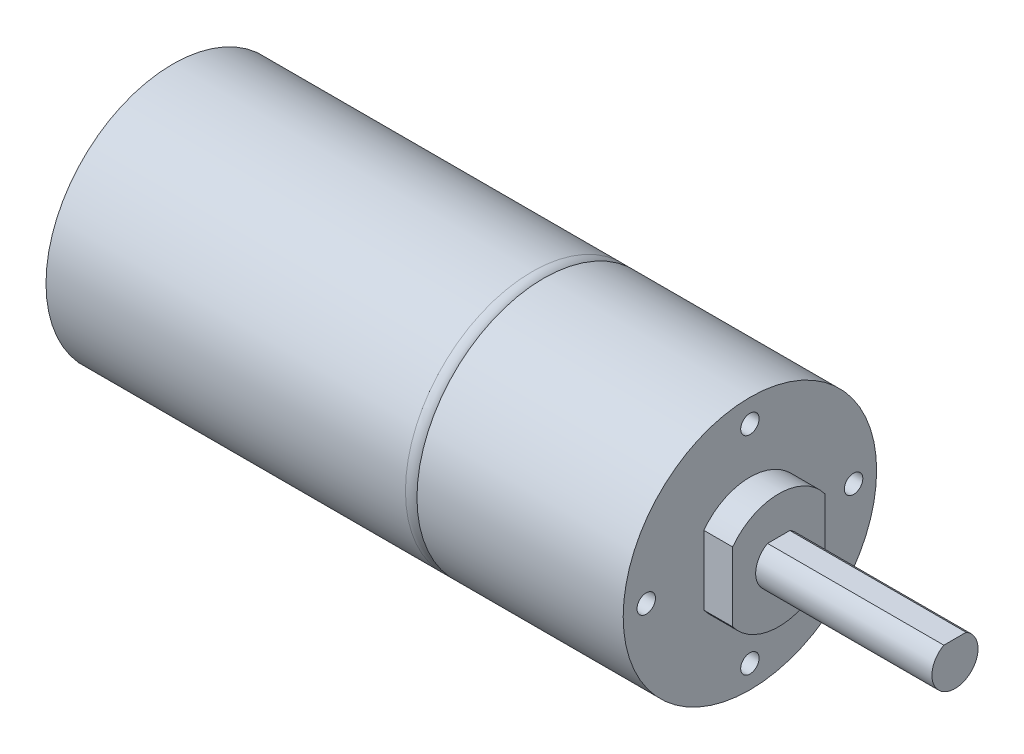
ISO-10303-21;
HEADER;
FILE_DESCRIPTION(('STEP AP214'),'2;1');
FILE_NAME('part.step','',(''),(''),'','','');
FILE_SCHEMA(('AUTOMOTIVE_DESIGN { 1 0 10303 214 1 1 1 1 }'));
ENDSEC;
DATA;
#1=APPLICATION_CONTEXT('core data for automotive mechanical design processes');
#2=APPLICATION_PROTOCOL_DEFINITION('international standard','automotive_design',2000,#1);
#3=PRODUCT_CONTEXT('',#1,'mechanical');
#4=PRODUCT('Part','Part','',(#3));
#5=PRODUCT_RELATED_PRODUCT_CATEGORY('part','',(#4));
#6=PRODUCT_DEFINITION_FORMATION('','',#4);
#7=PRODUCT_DEFINITION_CONTEXT('part definition',#1,'design');
#8=PRODUCT_DEFINITION('design','',#6,#7);
#9=PRODUCT_DEFINITION_SHAPE('','',#8);
#10=(LENGTH_UNIT() NAMED_UNIT(*) SI_UNIT(.MILLI.,.METRE.));
#11=(NAMED_UNIT(*) PLANE_ANGLE_UNIT() SI_UNIT($,.RADIAN.));
#12=(NAMED_UNIT(*) SI_UNIT($,.STERADIAN.) SOLID_ANGLE_UNIT());
#13=UNCERTAINTY_MEASURE_WITH_UNIT(LENGTH_MEASURE(1.E-05),#10,'distance_accuracy_value','');
#14=(GEOMETRIC_REPRESENTATION_CONTEXT(3) GLOBAL_UNCERTAINTY_ASSIGNED_CONTEXT((#13)) GLOBAL_UNIT_ASSIGNED_CONTEXT((#10,
#11,#12)) REPRESENTATION_CONTEXT('',''));
#15=CARTESIAN_POINT('',(0.,0.,0.));
#16=DIRECTION('',(0.,0.,1.));
#17=DIRECTION('',(1.,0.,0.));
#18=AXIS2_PLACEMENT_3D('',#15,#16,#17);
#19=CARTESIAN_POINT('',(20.4,0.,0.));
#20=DIRECTION('',(1.,0.,0.));
#21=DIRECTION('',(0.,0.,-1.));
#22=AXIS2_PLACEMENT_3D('',#19,#20,#21);
#23=PLANE('',#22);
#24=CARTESIAN_POINT('',(20.4,0.,0.));
#25=DIRECTION('',(1.,0.,0.));
#26=DIRECTION('',(0.,0.,-1.));
#27=AXIS2_PLACEMENT_3D('',#24,#25,#26);
#28=CIRCLE('',#27,5.);
#29=CARTESIAN_POINT('',(20.4,3.,-4.));
#30=VERTEX_POINT('',#29);
#31=CARTESIAN_POINT('',(20.4,3.,4.));
#32=VERTEX_POINT('',#31);
#33=EDGE_CURVE('E147',#30,#32,#28,.T.);
#34=ORIENTED_EDGE('',*,*,#33,.T.);
#35=DIRECTION('',(0.,-1.,0.));
#36=VECTOR('',#35,1.);
#37=CARTESIAN_POINT('',(20.4,0.,4.));
#38=LINE('',#37,#36);
#39=CARTESIAN_POINT('',(20.4,-3.,4.));
#40=VERTEX_POINT('',#39);
#41=EDGE_CURVE('E150',#32,#40,#38,.T.);
#42=ORIENTED_EDGE('',*,*,#41,.T.);
#43=CARTESIAN_POINT('',(20.4,-3.,-4.));
#44=VERTEX_POINT('',#43);
#45=EDGE_CURVE('E152',#40,#44,#28,.T.);
#46=ORIENTED_EDGE('',*,*,#45,.T.);
#47=DIRECTION('',(0.,-1.,0.));
#48=VECTOR('',#47,1.);
#49=CARTESIAN_POINT('',(20.4,0.,-4.));
#50=LINE('',#49,#48);
#51=EDGE_CURVE('E154',#30,#44,#50,.T.);
#52=ORIENTED_EDGE('',*,*,#51,.F.);
#53=EDGE_LOOP('',(#34,#42,#46,#52));
#54=FACE_BOUND('',#53,.T.);
#55=CARTESIAN_POINT('',(20.4,0.,0.));
#56=DIRECTION('',(1.,0.,0.));
#57=DIRECTION('',(0.,0.,-1.));
#58=AXIS2_PLACEMENT_3D('',#55,#56,#57);
#59=CIRCLE('',#58,2.);
#60=CARTESIAN_POINT('',(20.4,1.75,0.968245836551854));
#61=VERTEX_POINT('',#60);
#62=CARTESIAN_POINT('',(20.4,1.75,-0.968245836551854));
#63=VERTEX_POINT('',#62);
#64=EDGE_CURVE('E53',#61,#63,#59,.T.);
#65=ORIENTED_EDGE('',*,*,#64,.F.);
#66=DIRECTION('',(0.,0.,-1.));
#67=VECTOR('',#66,1.);
#68=CARTESIAN_POINT('',(20.4,1.75,0.));
#69=LINE('',#68,#67);
#70=EDGE_CURVE('E134',#61,#63,#69,.T.);
#71=ORIENTED_EDGE('',*,*,#70,.T.);
#72=EDGE_LOOP('',(#65,#71));
#73=FACE_BOUND('',#72,.T.);
#74=ADVANCED_FACE('F39',(#54,#73),#23,.T.);
#75=CARTESIAN_POINT('',(17.9,0.,0.));
#76=DIRECTION('',(-1.,0.,0.));
#77=DIRECTION('',(0.,0.,1.));
#78=AXIS2_PLACEMENT_3D('',#75,#76,#77);
#79=CYLINDRICAL_SURFACE('',#78,11.);
#80=CARTESIAN_POINT('',(-1.,0.,0.));
#81=DIRECTION('',(1.,0.,0.));
#82=DIRECTION('',(0.,0.,-1.));
#83=AXIS2_PLACEMENT_3D('',#80,#81,#82);
#84=CIRCLE('',#83,11.);
#85=CARTESIAN_POINT('',(-1.,0.,11.));
#86=VERTEX_POINT('',#85);
#87=EDGE_CURVE('E180',#86,#86,#84,.T.);
#88=CARTESIAN_POINT('',(-32.2,0.,0.));
#89=DIRECTION('',(-1.,0.,0.));
#90=DIRECTION('',(0.,0.,1.));
#91=AXIS2_PLACEMENT_3D('',#88,#89,#90);
#92=CIRCLE('',#91,11.);
#93=CARTESIAN_POINT('',(-32.2,0.,11.));
#94=VERTEX_POINT('',#93);
#95=EDGE_CURVE('E47',#94,#94,#92,.T.);
#96=CARTESIAN_POINT('',(-1.,0.,11.));
#97=CARTESIAN_POINT('',(-1.325,0.,11.));
#98=CARTESIAN_POINT('',(-1.65,0.,11.));
#99=CARTESIAN_POINT('',(-2.3,0.,11.));
#100=CARTESIAN_POINT('',(-2.625,0.,11.));
#101=CARTESIAN_POINT('',(-3.275,0.,11.));
#102=CARTESIAN_POINT('',(-3.6,0.,11.));
#103=CARTESIAN_POINT('',(-4.25,0.,11.));
#104=CARTESIAN_POINT('',(-4.57500000000001,0.,11.));
#105=CARTESIAN_POINT('',(-5.225,0.,11.));
#106=CARTESIAN_POINT('',(-5.55000000000001,0.,11.));
#107=CARTESIAN_POINT('',(-6.2,0.,11.));
#108=CARTESIAN_POINT('',(-6.52500000000001,0.,11.));
#109=CARTESIAN_POINT('',(-7.175,0.,11.));
#110=CARTESIAN_POINT('',(-7.5,0.,11.));
#111=CARTESIAN_POINT('',(-8.15,0.,11.));
#112=CARTESIAN_POINT('',(-8.475,0.,11.));
#113=CARTESIAN_POINT('',(-9.12500000000001,0.,11.));
#114=CARTESIAN_POINT('',(-9.45,0.,11.));
#115=CARTESIAN_POINT('',(-10.1,0.,11.));
#116=CARTESIAN_POINT('',(-10.425,0.,11.));
#117=CARTESIAN_POINT('',(-11.075,0.,11.));
#118=CARTESIAN_POINT('',(-11.4,0.,11.));
#119=CARTESIAN_POINT('',(-12.05,0.,11.));
#120=CARTESIAN_POINT('',(-12.375,0.,11.));
#121=CARTESIAN_POINT('',(-13.025,0.,11.));
#122=CARTESIAN_POINT('',(-13.35,0.,11.));
#123=CARTESIAN_POINT('',(-14.,0.,11.));
#124=CARTESIAN_POINT('',(-14.325,0.,11.));
#125=CARTESIAN_POINT('',(-14.975,0.,11.));
#126=CARTESIAN_POINT('',(-15.3,0.,11.));
#127=CARTESIAN_POINT('',(-15.95,0.,11.));
#128=CARTESIAN_POINT('',(-16.275,0.,11.));
#129=CARTESIAN_POINT('',(-16.925,0.,11.));
#130=CARTESIAN_POINT('',(-17.25,0.,11.));
#131=CARTESIAN_POINT('',(-17.9,0.,11.));
#132=CARTESIAN_POINT('',(-18.225,0.,11.));
#133=CARTESIAN_POINT('',(-18.875,0.,11.));
#134=CARTESIAN_POINT('',(-19.2,0.,11.));
#135=CARTESIAN_POINT('',(-19.85,0.,11.));
#136=CARTESIAN_POINT('',(-20.175,0.,11.));
#137=CARTESIAN_POINT('',(-20.825,0.,11.));
#138=CARTESIAN_POINT('',(-21.15,0.,11.));
#139=CARTESIAN_POINT('',(-21.8,0.,11.));
#140=CARTESIAN_POINT('',(-22.125,0.,11.));
#141=CARTESIAN_POINT('',(-22.775,0.,11.));
#142=CARTESIAN_POINT('',(-23.1,0.,11.));
#143=CARTESIAN_POINT('',(-23.75,0.,11.));
#144=CARTESIAN_POINT('',(-24.075,0.,11.));
#145=CARTESIAN_POINT('',(-24.725,0.,11.));
#146=CARTESIAN_POINT('',(-25.05,0.,11.));
#147=CARTESIAN_POINT('',(-25.7,0.,11.));
#148=CARTESIAN_POINT('',(-26.025,0.,11.));
#149=CARTESIAN_POINT('',(-26.675,0.,11.));
#150=CARTESIAN_POINT('',(-27.,0.,11.));
#151=CARTESIAN_POINT('',(-27.65,0.,11.));
#152=CARTESIAN_POINT('',(-27.975,0.,11.));
#153=CARTESIAN_POINT('',(-28.625,0.,11.));
#154=CARTESIAN_POINT('',(-28.95,0.,11.));
#155=CARTESIAN_POINT('',(-29.6,0.,11.));
#156=CARTESIAN_POINT('',(-29.925,0.,11.));
#157=CARTESIAN_POINT('',(-30.575,0.,11.));
#158=CARTESIAN_POINT('',(-30.9,0.,11.));
#159=CARTESIAN_POINT('',(-31.55,0.,11.));
#160=CARTESIAN_POINT('',(-31.875,0.,11.));
#161=CARTESIAN_POINT('',(-32.2,0.,11.));
#162=B_SPLINE_CURVE_WITH_KNOTS('',3,(#96,#97,#98,#99,#100,#101,#102,#103,#104,#105,#106,#107,
#108,#109,#110,#111,#112,#113,#114,#115,#116,#117,#118,#119,#120,#121,#122,#123,#124,#125,#126,
#127,#128,#129,#130,#131,#132,#133,#134,#135,#136,#137,#138,#139,#140,#141,#142,#143,#144,#145,
#146,#147,#148,#149,#150,#151,#152,#153,#154,#155,#156,#157,#158,#159,#160,#161),.UNSPECIFIED.,
.F.,.F.,(4,2,2,2,2,2,2,2,2,2,2,2,2,2,2,2,2,2,2,2,2,2,2,2,2,2,2,2,2,2,2,2,4),(0.,0.975,1.95,
2.925,3.9,4.875,5.85,6.825,7.8,8.775,9.75,10.725,11.7,12.675,13.65,14.625,15.6,16.575,17.55,
18.525,19.5,20.475,21.45,22.425,23.4,24.375,25.35,26.325,27.3,28.275,29.25,30.225,31.2),.UNSPECIFIED.);
#163=EDGE_CURVE('BSEAM187',#86,#94,#162,.T.);
#164=ORIENTED_EDGE('',*,*,#87,.F.);
#165=ORIENTED_EDGE('',*,*,#95,.F.);
#166=ORIENTED_EDGE('',*,*,#163,.T.);
#167=ORIENTED_EDGE('',*,*,#163,.F.);
#168=EDGE_LOOP('',(#164,#166,#165,#167));
#169=FACE_BOUND('',#168,.T.);
#170=ADVANCED_FACE('F187',(#169),#79,.T.);
#171=CARTESIAN_POINT('',(-32.2,0.,0.));
#172=DIRECTION('',(-1.,0.,0.));
#173=DIRECTION('',(0.,0.,1.));
#174=AXIS2_PLACEMENT_3D('',#171,#172,#173);
#175=PLANE('',#174);
#176=ORIENTED_EDGE('',*,*,#95,.T.);
#177=EDGE_LOOP('',(#176));
#178=FACE_BOUND('',#177,.T.);
#179=ADVANCED_FACE('F185',(#178),#175,.T.);
#180=CARTESIAN_POINT('',(-1.,0.,0.));
#181=DIRECTION('',(1.,0.,0.));
#182=DIRECTION('',(0.,0.,-1.));
#183=AXIS2_PLACEMENT_3D('',#180,#181,#182);
#184=TOROIDAL_SURFACE('',#183,10.,1.);
#185=CARTESIAN_POINT('',(0.,0.,0.));
#186=DIRECTION('',(1.,0.,0.));
#187=DIRECTION('',(0.,0.,-1.));
#188=AXIS2_PLACEMENT_3D('',#185,#186,#187);
#189=CIRCLE('',#188,10.);
#190=CARTESIAN_POINT('',(0.,0.,-10.));
#191=VERTEX_POINT('',#190);
#192=EDGE_CURVE('E177',#191,#191,#189,.T.);
#193=ORIENTED_EDGE('',*,*,#192,.F.);
#194=EDGE_LOOP('',(#193));
#195=FACE_BOUND('',#194,.T.);
#196=ORIENTED_EDGE('',*,*,#87,.T.);
#197=EDGE_LOOP('',(#196));
#198=FACE_BOUND('',#197,.T.);
#199=ADVANCED_FACE('F194',(#195,#198),#184,.T.);
#200=CARTESIAN_POINT('',(0.,11.,0.));
#201=DIRECTION('',(1.,0.,0.));
#202=DIRECTION('',(0.,0.,-1.));
#203=AXIS2_PLACEMENT_3D('',#200,#201,#202);
#204=PLANE('',#203);
#205=CARTESIAN_POINT('',(0.,0.,0.));
#206=DIRECTION('',(1.,0.,0.));
#207=DIRECTION('',(0.,0.,-1.));
#208=AXIS2_PLACEMENT_3D('',#205,#206,#207);
#209=CIRCLE('',#208,11.);
#210=CARTESIAN_POINT('',(0.,0.,11.));
#211=VERTEX_POINT('',#210);
#212=EDGE_CURVE('E174',#211,#211,#209,.T.);
#213=ORIENTED_EDGE('',*,*,#212,.F.);
#214=EDGE_LOOP('',(#213));
#215=FACE_BOUND('',#214,.T.);
#216=ORIENTED_EDGE('',*,*,#192,.T.);
#217=EDGE_LOOP('',(#216));
#218=FACE_BOUND('',#217,.T.);
#219=ADVANCED_FACE('F211',(#215,#218),#204,.F.);
#220=CARTESIAN_POINT('',(17.9,0.,0.));
#221=DIRECTION('',(1.,0.,0.));
#222=DIRECTION('',(0.,0.,-1.));
#223=AXIS2_PLACEMENT_3D('',#220,#221,#222);
#224=PLANE('',#223);
#225=CARTESIAN_POINT('',(17.9,9.,0.));
#226=DIRECTION('',(1.,0.,0.));
#227=DIRECTION('',(0.,0.,-1.));
#228=AXIS2_PLACEMENT_3D('',#225,#226,#227);
#229=CIRCLE('',#228,0.8);
#230=CARTESIAN_POINT('',(17.9,9.,-0.8));
#231=VERTEX_POINT('',#230);
#232=EDGE_CURVE('E111',#231,#231,#229,.T.);
#233=ORIENTED_EDGE('',*,*,#232,.F.);
#234=EDGE_LOOP('',(#233));
#235=FACE_BOUND('',#234,.T.);
#236=CARTESIAN_POINT('',(17.9,0.,9.));
#237=DIRECTION('',(1.,0.,0.));
#238=DIRECTION('',(0.,0.,-1.));
#239=AXIS2_PLACEMENT_3D('',#236,#237,#238);
#240=CIRCLE('',#239,0.8);
#241=CARTESIAN_POINT('',(17.9,0.,8.2));
#242=VERTEX_POINT('',#241);
#243=EDGE_CURVE('E119',#242,#242,#240,.T.);
#244=ORIENTED_EDGE('',*,*,#243,.F.);
#245=EDGE_LOOP('',(#244));
#246=FACE_BOUND('',#245,.T.);
#247=CARTESIAN_POINT('',(17.9,0.,-9.));
#248=DIRECTION('',(1.,0.,0.));
#249=DIRECTION('',(0.,0.,-1.));
#250=AXIS2_PLACEMENT_3D('',#247,#248,#249);
#251=CIRCLE('',#250,0.8);
#252=CARTESIAN_POINT('',(17.9,0.,-9.8));
#253=VERTEX_POINT('',#252);
#254=EDGE_CURVE('E125',#253,#253,#251,.T.);
#255=ORIENTED_EDGE('',*,*,#254,.F.);
#256=EDGE_LOOP('',(#255));
#257=FACE_BOUND('',#256,.T.);
#258=CARTESIAN_POINT('',(17.9,-9.,0.));
#259=DIRECTION('',(1.,0.,0.));
#260=DIRECTION('',(0.,0.,-1.));
#261=AXIS2_PLACEMENT_3D('',#258,#259,#260);
#262=CIRCLE('',#261,0.8);
#263=CARTESIAN_POINT('',(17.9,-9.,-0.800000000000001));
#264=VERTEX_POINT('',#263);
#265=EDGE_CURVE('E131',#264,#264,#262,.T.);
#266=ORIENTED_EDGE('',*,*,#265,.F.);
#267=EDGE_LOOP('',(#266));
#268=FACE_BOUND('',#267,.T.);
#269=CARTESIAN_POINT('',(17.9,0.,0.));
#270=DIRECTION('',(1.,0.,0.));
#271=DIRECTION('',(0.,0.,-1.));
#272=AXIS2_PLACEMENT_3D('',#269,#270,#271);
#273=CIRCLE('',#272,5.);
#274=CARTESIAN_POINT('',(17.9,3.,-4.));
#275=VERTEX_POINT('',#274);
#276=CARTESIAN_POINT('',(17.9,3.,4.));
#277=VERTEX_POINT('',#276);
#278=EDGE_CURVE('E61',#275,#277,#273,.T.);
#279=ORIENTED_EDGE('',*,*,#278,.F.);
#280=DIRECTION('',(0.,-1.,0.));
#281=VECTOR('',#280,1.);
#282=CARTESIAN_POINT('',(17.9,0.,-4.));
#283=LINE('',#282,#281);
#284=CARTESIAN_POINT('',(17.9,-3.,-4.));
#285=VERTEX_POINT('',#284);
#286=EDGE_CURVE('E151',#275,#285,#283,.T.);
#287=ORIENTED_EDGE('',*,*,#286,.T.);
#288=CARTESIAN_POINT('',(17.9,-3.,4.));
#289=VERTEX_POINT('',#288);
#290=EDGE_CURVE('E160',#289,#285,#273,.T.);
#291=ORIENTED_EDGE('',*,*,#290,.F.);
#292=DIRECTION('',(0.,-1.,0.));
#293=VECTOR('',#292,1.);
#294=CARTESIAN_POINT('',(17.9,0.,4.));
#295=LINE('',#294,#293);
#296=EDGE_CURVE('E159',#277,#289,#295,.T.);
#297=ORIENTED_EDGE('',*,*,#296,.F.);
#298=EDGE_LOOP('',(#279,#287,#291,#297));
#299=FACE_BOUND('',#298,.T.);
#300=CARTESIAN_POINT('',(17.9,0.,0.));
#301=DIRECTION('',(1.,0.,0.));
#302=DIRECTION('',(0.,0.,-1.));
#303=AXIS2_PLACEMENT_3D('',#300,#301,#302);
#304=CIRCLE('',#303,11.);
#305=CARTESIAN_POINT('',(17.9,0.,11.));
#306=VERTEX_POINT('',#305);
#307=EDGE_CURVE('E11',#306,#306,#304,.T.);
#308=ORIENTED_EDGE('',*,*,#307,.T.);
#309=EDGE_LOOP('',(#308));
#310=FACE_BOUND('',#309,.T.);
#311=ADVANCED_FACE('F201',(#235,#246,#257,#268,#299,#310),#224,.T.);
#312=CARTESIAN_POINT('',(0.,0.,11.));
#313=CARTESIAN_POINT('',(0.18645833333333,0.,11.));
#314=CARTESIAN_POINT('',(0.372916666666664,0.,11.));
#315=CARTESIAN_POINT('',(0.745833333333331,0.,11.));
#316=CARTESIAN_POINT('',(0.932291666666665,0.,11.));
#317=CARTESIAN_POINT('',(1.30520833333333,0.,11.));
#318=CARTESIAN_POINT('',(1.49166666666666,0.,11.));
#319=CARTESIAN_POINT('',(1.86458333333333,0.,11.));
#320=CARTESIAN_POINT('',(2.05104166666666,0.,11.));
#321=CARTESIAN_POINT('',(2.42395833333333,0.,11.));
#322=CARTESIAN_POINT('',(2.61041666666666,0.,11.));
#323=CARTESIAN_POINT('',(2.98333333333333,0.,11.));
#324=CARTESIAN_POINT('',(3.16979166666666,0.,11.));
#325=CARTESIAN_POINT('',(3.54270833333333,0.,11.));
#326=CARTESIAN_POINT('',(3.72916666666666,0.,11.));
#327=CARTESIAN_POINT('',(4.10208333333333,0.,11.));
#328=CARTESIAN_POINT('',(4.28854166666666,0.,11.));
#329=CARTESIAN_POINT('',(4.66145833333333,0.,11.));
#330=CARTESIAN_POINT('',(4.84791666666666,0.,11.));
#331=CARTESIAN_POINT('',(5.22083333333333,0.,11.));
#332=CARTESIAN_POINT('',(5.40729166666666,0.,11.));
#333=CARTESIAN_POINT('',(5.78020833333333,0.,11.));
#334=CARTESIAN_POINT('',(5.96666666666666,0.,11.));
#335=CARTESIAN_POINT('',(6.33958333333333,0.,11.));
#336=CARTESIAN_POINT('',(6.52604166666666,0.,11.));
#337=CARTESIAN_POINT('',(6.89895833333333,0.,11.));
#338=CARTESIAN_POINT('',(7.08541666666666,0.,11.));
#339=CARTESIAN_POINT('',(7.45833333333333,0.,11.));
#340=CARTESIAN_POINT('',(7.64479166666666,0.,11.));
#341=CARTESIAN_POINT('',(8.01770833333333,0.,11.));
#342=CARTESIAN_POINT('',(8.20416666666666,0.,11.));
#343=CARTESIAN_POINT('',(8.57708333333333,0.,11.));
#344=CARTESIAN_POINT('',(8.76354166666667,0.,11.));
#345=CARTESIAN_POINT('',(9.13645833333333,0.,11.));
#346=CARTESIAN_POINT('',(9.32291666666666,0.,11.));
#347=CARTESIAN_POINT('',(9.69583333333333,0.,11.));
#348=CARTESIAN_POINT('',(9.88229166666666,0.,11.));
#349=CARTESIAN_POINT('',(10.2552083333333,0.,11.));
#350=CARTESIAN_POINT('',(10.4416666666667,0.,11.));
#351=CARTESIAN_POINT('',(10.8145833333333,0.,11.));
#352=CARTESIAN_POINT('',(11.0010416666667,0.,11.));
#353=CARTESIAN_POINT('',(11.3739583333333,0.,11.));
#354=CARTESIAN_POINT('',(11.5604166666667,0.,11.));
#355=CARTESIAN_POINT('',(11.9333333333333,0.,11.));
#356=CARTESIAN_POINT('',(12.1197916666667,0.,11.));
#357=CARTESIAN_POINT('',(12.4927083333333,0.,11.));
#358=CARTESIAN_POINT('',(12.6791666666667,0.,11.));
#359=CARTESIAN_POINT('',(13.0520833333333,0.,11.));
#360=CARTESIAN_POINT('',(13.2385416666667,0.,11.));
#361=CARTESIAN_POINT('',(13.6114583333333,0.,11.));
#362=CARTESIAN_POINT('',(13.7979166666667,0.,11.));
#363=CARTESIAN_POINT('',(14.1708333333333,0.,11.));
#364=CARTESIAN_POINT('',(14.3572916666667,0.,11.));
#365=CARTESIAN_POINT('',(14.7302083333333,0.,11.));
#366=CARTESIAN_POINT('',(14.9166666666667,0.,11.));
#367=CARTESIAN_POINT('',(15.2895833333333,0.,11.));
#368=CARTESIAN_POINT('',(15.4760416666667,0.,11.));
#369=CARTESIAN_POINT('',(15.8489583333333,0.,11.));
#370=CARTESIAN_POINT('',(16.0354166666667,0.,11.));
#371=CARTESIAN_POINT('',(16.4083333333333,0.,11.));
#372=CARTESIAN_POINT('',(16.5947916666667,0.,11.));
#373=CARTESIAN_POINT('',(16.9677083333333,0.,11.));
#374=CARTESIAN_POINT('',(17.1541666666667,0.,11.));
#375=CARTESIAN_POINT('',(17.5270833333333,0.,11.));
#376=CARTESIAN_POINT('',(17.7135416666667,0.,11.));
#377=CARTESIAN_POINT('',(17.9,0.,11.));
#378=B_SPLINE_CURVE_WITH_KNOTS('',3,(#312,#313,#314,#315,#316,#317,#318,#319,#320,#321,#322,
#323,#324,#325,#326,#327,#328,#329,#330,#331,#332,#333,#334,#335,#336,#337,#338,#339,#340,#341,
#342,#343,#344,#345,#346,#347,#348,#349,#350,#351,#352,#353,#354,#355,#356,#357,#358,#359,#360,
#361,#362,#363,#364,#365,#366,#367,#368,#369,#370,#371,#372,#373,#374,#375,#376,#377),
.UNSPECIFIED.,.F.,.F.,(4,2,2,2,2,2,2,2,2,2,2,2,2,2,2,2,2,2,2,2,2,2,2,2,2,2,2,2,2,2,2,2,4),(0.,
0.559375000000001,1.11875,1.678125,2.2375,2.796875,3.35625,3.915625,4.475,5.034375,5.59375,
6.153125,6.7125,7.271875,7.83125,8.390625,8.95,9.509375,10.06875,10.628125,11.1875,11.746875,
12.30625,12.865625,13.425,13.984375,14.54375,15.103125,15.6625,16.221875,16.78125,17.340625,
17.9),.UNSPECIFIED.);
#379=EDGE_CURVE('BSEAM41',#211,#306,#378,.T.);
#380=ORIENTED_EDGE('',*,*,#212,.T.);
#381=ORIENTED_EDGE('',*,*,#307,.F.);
#382=ORIENTED_EDGE('',*,*,#379,.T.);
#383=ORIENTED_EDGE('',*,*,#379,.F.);
#384=EDGE_LOOP('',(#380,#382,#381,#383));
#385=FACE_BOUND('',#384,.T.);
#386=ADVANCED_FACE('F41',(#385),#79,.T.);
#387=CARTESIAN_POINT('',(20.4,0.,0.));
#388=DIRECTION('',(-1.,0.,0.));
#389=DIRECTION('',(0.,0.,1.));
#390=AXIS2_PLACEMENT_3D('',#387,#388,#389);
#391=CYLINDRICAL_SURFACE('',#390,5.);
#392=ORIENTED_EDGE('',*,*,#278,.T.);
#393=DIRECTION('',(-1.,0.,0.));
#394=VECTOR('',#393,1.);
#395=CARTESIAN_POINT('',(20.4,3.,4.));
#396=LINE('',#395,#394);
#397=EDGE_CURVE('E171',#32,#277,#396,.T.);
#398=ORIENTED_EDGE('',*,*,#397,.F.);
#399=ORIENTED_EDGE('',*,*,#33,.F.);
#400=DIRECTION('',(-1.,0.,0.));
#401=VECTOR('',#400,1.);
#402=CARTESIAN_POINT('',(20.4,3.,-4.));
#403=LINE('',#402,#401);
#404=EDGE_CURVE('E157',#30,#275,#403,.T.);
#405=ORIENTED_EDGE('',*,*,#404,.T.);
#406=EDGE_LOOP('',(#392,#398,#399,#405));
#407=FACE_BOUND('',#406,.T.);
#408=ADVANCED_FACE('F200',(#407),#391,.T.);
#409=CARTESIAN_POINT('',(20.4,0.,4.));
#410=DIRECTION('',(0.,0.,-1.));
#411=DIRECTION('',(-1.,0.,0.));
#412=AXIS2_PLACEMENT_3D('',#409,#410,#411);
#413=PLANE('',#412);
#414=ORIENTED_EDGE('',*,*,#296,.T.);
#415=DIRECTION('',(-1.,0.,0.));
#416=VECTOR('',#415,1.);
#417=CARTESIAN_POINT('',(20.4,-3.,4.));
#418=LINE('',#417,#416);
#419=EDGE_CURVE('E168',#40,#289,#418,.T.);
#420=ORIENTED_EDGE('',*,*,#419,.F.);
#421=ORIENTED_EDGE('',*,*,#41,.F.);
#422=ORIENTED_EDGE('',*,*,#397,.T.);
#423=EDGE_LOOP('',(#414,#420,#421,#422));
#424=FACE_BOUND('',#423,.T.);
#425=ADVANCED_FACE('F207',(#424),#413,.F.);
#426=ORIENTED_EDGE('',*,*,#290,.T.);
#427=DIRECTION('',(-1.,0.,0.));
#428=VECTOR('',#427,1.);
#429=CARTESIAN_POINT('',(20.4,-3.,-4.));
#430=LINE('',#429,#428);
#431=EDGE_CURVE('E165',#44,#285,#430,.T.);
#432=ORIENTED_EDGE('',*,*,#431,.F.);
#433=ORIENTED_EDGE('',*,*,#45,.F.);
#434=ORIENTED_EDGE('',*,*,#419,.T.);
#435=EDGE_LOOP('',(#426,#432,#433,#434));
#436=FACE_BOUND('',#435,.T.);
#437=ADVANCED_FACE('F210',(#436),#391,.T.);
#438=CARTESIAN_POINT('',(20.4,0.,-4.));
#439=DIRECTION('',(0.,0.,-1.));
#440=DIRECTION('',(-1.,0.,0.));
#441=AXIS2_PLACEMENT_3D('',#438,#439,#440);
#442=PLANE('',#441);
#443=ORIENTED_EDGE('',*,*,#286,.F.);
#444=ORIENTED_EDGE('',*,*,#404,.F.);
#445=ORIENTED_EDGE('',*,*,#51,.T.);
#446=ORIENTED_EDGE('',*,*,#431,.T.);
#447=EDGE_LOOP('',(#443,#444,#445,#446));
#448=FACE_BOUND('',#447,.T.);
#449=ADVANCED_FACE('F233',(#448),#442,.T.);
#450=CARTESIAN_POINT('',(35.7,1.75,0.));
#451=DIRECTION('',(0.,1.,0.));
#452=DIRECTION('',(0.,0.,1.));
#453=AXIS2_PLACEMENT_3D('',#450,#451,#452);
#454=PLANE('',#453);
#455=ORIENTED_EDGE('',*,*,#70,.F.);
#456=DIRECTION('',(-1.,0.,0.));
#457=VECTOR('',#456,1.);
#458=CARTESIAN_POINT('',(35.7,1.75,0.968245836551854));
#459=LINE('',#458,#457);
#460=CARTESIAN_POINT('',(35.7,1.75,0.968245836551854));
#461=VERTEX_POINT('',#460);
#462=EDGE_CURVE('E145',#461,#61,#459,.T.);
#463=ORIENTED_EDGE('',*,*,#462,.F.);
#464=DIRECTION('',(0.,0.,-1.));
#465=VECTOR('',#464,1.);
#466=CARTESIAN_POINT('',(35.7,1.75,0.));
#467=LINE('',#466,#465);
#468=CARTESIAN_POINT('',(35.7,1.75,-0.968245836551854));
#469=VERTEX_POINT('',#468);
#470=EDGE_CURVE('E135',#461,#469,#467,.T.);
#471=ORIENTED_EDGE('',*,*,#470,.T.);
#472=DIRECTION('',(-1.,0.,0.));
#473=VECTOR('',#472,1.);
#474=CARTESIAN_POINT('',(35.7,1.75,-0.968245836551854));
#475=LINE('',#474,#473);
#476=EDGE_CURVE('E140',#469,#63,#475,.T.);
#477=ORIENTED_EDGE('',*,*,#476,.T.);
#478=EDGE_LOOP('',(#455,#463,#471,#477));
#479=FACE_BOUND('',#478,.T.);
#480=ADVANCED_FACE('F236',(#479),#454,.T.);
#481=CARTESIAN_POINT('',(35.7,0.,0.));
#482=DIRECTION('',(-1.,0.,0.));
#483=DIRECTION('',(0.,0.,1.));
#484=AXIS2_PLACEMENT_3D('',#481,#482,#483);
#485=CYLINDRICAL_SURFACE('',#484,2.);
#486=ORIENTED_EDGE('',*,*,#64,.T.);
#487=ORIENTED_EDGE('',*,*,#476,.F.);
#488=CARTESIAN_POINT('',(35.7,0.,0.));
#489=DIRECTION('',(1.,0.,0.));
#490=DIRECTION('',(0.,0.,-1.));
#491=AXIS2_PLACEMENT_3D('',#488,#489,#490);
#492=CIRCLE('',#491,2.);
#493=EDGE_CURVE('E138',#461,#469,#492,.T.);
#494=ORIENTED_EDGE('',*,*,#493,.F.);
#495=ORIENTED_EDGE('',*,*,#462,.T.);
#496=EDGE_LOOP('',(#486,#487,#494,#495));
#497=FACE_BOUND('',#496,.T.);
#498=ADVANCED_FACE('F241',(#497),#485,.T.);
#499=CARTESIAN_POINT('',(35.7,0.,0.));
#500=DIRECTION('',(1.,0.,0.));
#501=DIRECTION('',(0.,0.,-1.));
#502=AXIS2_PLACEMENT_3D('',#499,#500,#501);
#503=PLANE('',#502);
#504=ORIENTED_EDGE('',*,*,#470,.F.);
#505=ORIENTED_EDGE('',*,*,#493,.T.);
#506=EDGE_LOOP('',(#504,#505));
#507=FACE_BOUND('',#506,.T.);
#508=ADVANCED_FACE('F245',(#507),#503,.T.);
#509=CARTESIAN_POINT('',(17.9,-9.,0.));
#510=DIRECTION('',(1.,0.,0.));
#511=DIRECTION('',(0.,0.,-1.));
#512=AXIS2_PLACEMENT_3D('',#509,#510,#511);
#513=CYLINDRICAL_SURFACE('',#512,0.8);
#514=CARTESIAN_POINT('',(14.7,-9.,0.));
#515=DIRECTION('',(1.,0.,0.));
#516=DIRECTION('',(0.,0.,-1.));
#517=AXIS2_PLACEMENT_3D('',#514,#515,#516);
#518=CIRCLE('',#517,0.8);
#519=CARTESIAN_POINT('',(14.7,-9.,-0.800000000000001));
#520=VERTEX_POINT('',#519);
#521=EDGE_CURVE('E128',#520,#520,#518,.T.);
#522=ORIENTED_EDGE('',*,*,#521,.F.);
#523=EDGE_LOOP('',(#522));
#524=FACE_BOUND('',#523,.T.);
#525=ORIENTED_EDGE('',*,*,#265,.T.);
#526=EDGE_LOOP('',(#525));
#527=FACE_BOUND('',#526,.T.);
#528=ADVANCED_FACE('F249',(#524,#527),#513,.F.);
#529=CARTESIAN_POINT('',(14.7,-9.,0.));
#530=DIRECTION('',(1.,0.,0.));
#531=DIRECTION('',(0.,0.,-1.));
#532=AXIS2_PLACEMENT_3D('',#529,#530,#531);
#533=CONICAL_SURFACE('',#532,0.8,1.02974425867666);
#534=CARTESIAN_POINT('',(14.219311504778,-9.,0.));
#535=VERTEX_POINT('',#534);
#536=VERTEX_LOOP('',#535);
#537=FACE_BOUND('',#536,.T.);
#538=ORIENTED_EDGE('',*,*,#521,.T.);
#539=EDGE_LOOP('',(#538));
#540=FACE_BOUND('',#539,.T.);
#541=ADVANCED_FACE('F253',(#537,#540),#533,.F.);
#542=CARTESIAN_POINT('',(17.9,0.,-9.));
#543=DIRECTION('',(1.,0.,0.));
#544=DIRECTION('',(0.,0.,-1.));
#545=AXIS2_PLACEMENT_3D('',#542,#543,#544);
#546=CYLINDRICAL_SURFACE('',#545,0.8);
#547=CARTESIAN_POINT('',(14.7,0.,-9.));
#548=DIRECTION('',(1.,0.,0.));
#549=DIRECTION('',(0.,0.,-1.));
#550=AXIS2_PLACEMENT_3D('',#547,#548,#549);
#551=CIRCLE('',#550,0.8);
#552=CARTESIAN_POINT('',(14.7,0.,-9.8));
#553=VERTEX_POINT('',#552);
#554=EDGE_CURVE('E122',#553,#553,#551,.T.);
#555=ORIENTED_EDGE('',*,*,#554,.F.);
#556=EDGE_LOOP('',(#555));
#557=FACE_BOUND('',#556,.T.);
#558=ORIENTED_EDGE('',*,*,#254,.T.);
#559=EDGE_LOOP('',(#558));
#560=FACE_BOUND('',#559,.T.);
#561=ADVANCED_FACE('F257',(#557,#560),#546,.F.);
#562=CARTESIAN_POINT('',(14.7,0.,-9.));
#563=DIRECTION('',(1.,0.,0.));
#564=DIRECTION('',(0.,0.,-1.));
#565=AXIS2_PLACEMENT_3D('',#562,#563,#564);
#566=CONICAL_SURFACE('',#565,0.8,1.02974425867666);
#567=CARTESIAN_POINT('',(14.219311504778,0.,-9.));
#568=VERTEX_POINT('',#567);
#569=VERTEX_LOOP('',#568);
#570=FACE_BOUND('',#569,.T.);
#571=ORIENTED_EDGE('',*,*,#554,.T.);
#572=EDGE_LOOP('',(#571));
#573=FACE_BOUND('',#572,.T.);
#574=ADVANCED_FACE('F261',(#570,#573),#566,.F.);
#575=CARTESIAN_POINT('',(17.9,0.,9.));
#576=DIRECTION('',(1.,0.,0.));
#577=DIRECTION('',(0.,0.,-1.));
#578=AXIS2_PLACEMENT_3D('',#575,#576,#577);
#579=CYLINDRICAL_SURFACE('',#578,0.8);
#580=CARTESIAN_POINT('',(14.7,0.,9.));
#581=DIRECTION('',(1.,0.,0.));
#582=DIRECTION('',(0.,0.,-1.));
#583=AXIS2_PLACEMENT_3D('',#580,#581,#582);
#584=CIRCLE('',#583,0.8);
#585=CARTESIAN_POINT('',(14.7,0.,8.2));
#586=VERTEX_POINT('',#585);
#587=EDGE_CURVE('E114',#586,#586,#584,.T.);
#588=ORIENTED_EDGE('',*,*,#587,.F.);
#589=EDGE_LOOP('',(#588));
#590=FACE_BOUND('',#589,.T.);
#591=ORIENTED_EDGE('',*,*,#243,.T.);
#592=EDGE_LOOP('',(#591));
#593=FACE_BOUND('',#592,.T.);
#594=ADVANCED_FACE('F265',(#590,#593),#579,.F.);
#595=CARTESIAN_POINT('',(14.7,0.,9.));
#596=DIRECTION('',(1.,0.,0.));
#597=DIRECTION('',(0.,0.,-1.));
#598=AXIS2_PLACEMENT_3D('',#595,#596,#597);
#599=CONICAL_SURFACE('',#598,0.8,1.02974425867666);
#600=CARTESIAN_POINT('',(14.219311504778,0.,9.));
#601=VERTEX_POINT('',#600);
#602=VERTEX_LOOP('',#601);
#603=FACE_BOUND('',#602,.T.);
#604=ORIENTED_EDGE('',*,*,#587,.T.);
#605=EDGE_LOOP('',(#604));
#606=FACE_BOUND('',#605,.T.);
#607=ADVANCED_FACE('F269',(#603,#606),#599,.F.);
#608=CARTESIAN_POINT('',(17.9,9.,0.));
#609=DIRECTION('',(1.,0.,0.));
#610=DIRECTION('',(0.,0.,-1.));
#611=AXIS2_PLACEMENT_3D('',#608,#609,#610);
#612=CYLINDRICAL_SURFACE('',#611,0.8);
#613=CARTESIAN_POINT('',(14.7,9.,0.));
#614=DIRECTION('',(1.,0.,0.));
#615=DIRECTION('',(0.,0.,-1.));
#616=AXIS2_PLACEMENT_3D('',#613,#614,#615);
#617=CIRCLE('',#616,0.8);
#618=CARTESIAN_POINT('',(14.7,9.,-0.8));
#619=VERTEX_POINT('',#618);
#620=EDGE_CURVE('E109',#619,#619,#617,.T.);
#621=ORIENTED_EDGE('',*,*,#620,.F.);
#622=EDGE_LOOP('',(#621));
#623=FACE_BOUND('',#622,.T.);
#624=ORIENTED_EDGE('',*,*,#232,.T.);
#625=EDGE_LOOP('',(#624));
#626=FACE_BOUND('',#625,.T.);
#627=ADVANCED_FACE('F105',(#623,#626),#612,.F.);
#628=CARTESIAN_POINT('',(14.7,9.,0.));
#629=DIRECTION('',(1.,0.,0.));
#630=DIRECTION('',(0.,0.,-1.));
#631=AXIS2_PLACEMENT_3D('',#628,#629,#630);
#632=CONICAL_SURFACE('',#631,0.8,1.02974425867666);
#633=CARTESIAN_POINT('',(14.219311504778,9.,0.));
#634=VERTEX_POINT('',#633);
#635=VERTEX_LOOP('',#634);
#636=FACE_BOUND('',#635,.T.);
#637=ORIENTED_EDGE('',*,*,#620,.T.);
#638=EDGE_LOOP('',(#637));
#639=FACE_BOUND('',#638,.T.);
#640=ADVANCED_FACE('F102',(#636,#639),#632,.F.);
#641=CLOSED_SHELL('',(#74,#170,#179,#199,#219,#311,#386,#408,#425,#437,#449,#480,#498,#508,#528,
#541,#561,#574,#594,#607,#627,#640));
#642=MANIFOLD_SOLID_BREP('B2',#641);
#643=ADVANCED_BREP_SHAPE_REPRESENTATION('',(#18,#642),#14);
#644=SHAPE_DEFINITION_REPRESENTATION(#9,#643);
ENDSEC;
END-ISO-10303-21;
